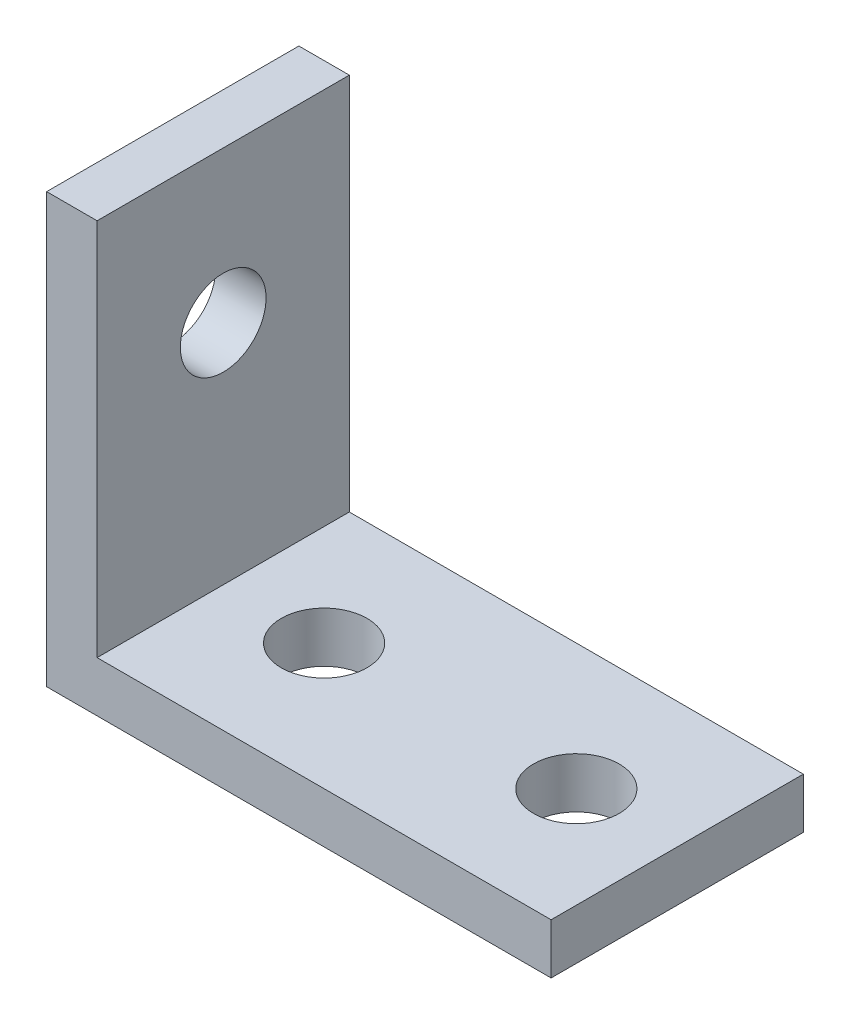
ISO-10303-21;
HEADER;
FILE_DESCRIPTION(('STEP AP214'),'2;1');
FILE_NAME('part.step','',(''),(''),'','','');
FILE_SCHEMA(('AUTOMOTIVE_DESIGN { 1 0 10303 214 1 1 1 1 }'));
ENDSEC;
DATA;
#1=APPLICATION_CONTEXT('core data for automotive mechanical design processes');
#2=APPLICATION_PROTOCOL_DEFINITION('international standard','automotive_design',2000,#1);
#3=PRODUCT_CONTEXT('',#1,'mechanical');
#4=PRODUCT('Part','Part','',(#3));
#5=PRODUCT_RELATED_PRODUCT_CATEGORY('part','',(#4));
#6=PRODUCT_DEFINITION_FORMATION('','',#4);
#7=PRODUCT_DEFINITION_CONTEXT('part definition',#1,'design');
#8=PRODUCT_DEFINITION('design','',#6,#7);
#9=PRODUCT_DEFINITION_SHAPE('','',#8);
#10=(LENGTH_UNIT() NAMED_UNIT(*) SI_UNIT(.MILLI.,.METRE.));
#11=(NAMED_UNIT(*) PLANE_ANGLE_UNIT() SI_UNIT($,.RADIAN.));
#12=(NAMED_UNIT(*) SI_UNIT($,.STERADIAN.) SOLID_ANGLE_UNIT());
#13=UNCERTAINTY_MEASURE_WITH_UNIT(LENGTH_MEASURE(1.E-05),#10,'distance_accuracy_value','');
#14=(GEOMETRIC_REPRESENTATION_CONTEXT(3) GLOBAL_UNCERTAINTY_ASSIGNED_CONTEXT((#13)) GLOBAL_UNIT_ASSIGNED_CONTEXT((#10,
#11,#12)) REPRESENTATION_CONTEXT('',''));
#15=CARTESIAN_POINT('',(0.,0.,0.));
#16=DIRECTION('',(0.,0.,1.));
#17=DIRECTION('',(1.,0.,0.));
#18=AXIS2_PLACEMENT_3D('',#15,#16,#17);
#19=CARTESIAN_POINT('',(0.,8.5,5.));
#20=DIRECTION('',(1.,0.,0.));
#21=DIRECTION('',(0.,1.,0.));
#22=AXIS2_PLACEMENT_3D('',#19,#20,#21);
#23=PLANE('',#22);
#24=CARTESIAN_POINT('',(0.,5.5,2.5));
#25=DIRECTION('',(1.,0.,0.));
#26=DIRECTION('',(0.,1.,0.));
#27=AXIS2_PLACEMENT_3D('',#24,#25,#26);
#28=CIRCLE('',#27,0.85);
#29=CARTESIAN_POINT('',(0.,6.35,2.5));
#30=VERTEX_POINT('',#29);
#31=EDGE_CURVE('E133',#30,#30,#28,.T.);
#32=ORIENTED_EDGE('',*,*,#31,.T.);
#33=EDGE_LOOP('',(#32));
#34=FACE_BOUND('',#33,.T.);
#35=DIRECTION('',(0.,-1.,0.));
#36=VECTOR('',#35,1.);
#37=CARTESIAN_POINT('',(0.,8.5,0.));
#38=LINE('',#37,#36);
#39=CARTESIAN_POINT('',(0.,8.5,0.));
#40=VERTEX_POINT('',#39);
#41=CARTESIAN_POINT('',(0.,0.,0.));
#42=VERTEX_POINT('',#41);
#43=EDGE_CURVE('E128',#40,#42,#38,.T.);
#44=ORIENTED_EDGE('',*,*,#43,.T.);
#45=DIRECTION('',(0.,0.,-1.));
#46=VECTOR('',#45,1.);
#47=CARTESIAN_POINT('',(0.,0.,5.));
#48=LINE('',#47,#46);
#49=CARTESIAN_POINT('',(0.,0.,5.));
#50=VERTEX_POINT('',#49);
#51=EDGE_CURVE('E11',#50,#42,#48,.T.);
#52=ORIENTED_EDGE('',*,*,#51,.F.);
#53=DIRECTION('',(0.,-1.,0.));
#54=VECTOR('',#53,1.);
#55=CARTESIAN_POINT('',(0.,8.5,5.));
#56=LINE('',#55,#54);
#57=CARTESIAN_POINT('',(0.,8.5,5.));
#58=VERTEX_POINT('',#57);
#59=EDGE_CURVE('E145',#58,#50,#56,.T.);
#60=ORIENTED_EDGE('',*,*,#59,.F.);
#61=DIRECTION('',(0.,0.,-1.));
#62=VECTOR('',#61,1.);
#63=CARTESIAN_POINT('',(0.,8.5,5.));
#64=LINE('',#63,#62);
#65=EDGE_CURVE('E124',#58,#40,#64,.T.);
#66=ORIENTED_EDGE('',*,*,#65,.T.);
#67=EDGE_LOOP('',(#44,#52,#60,#66));
#68=FACE_BOUND('',#67,.T.);
#69=ADVANCED_FACE('F39',(#34,#68),#23,.F.);
#70=CARTESIAN_POINT('',(0.,0.,5.));
#71=DIRECTION('',(0.,1.,0.));
#72=DIRECTION('',(0.,0.,1.));
#73=AXIS2_PLACEMENT_3D('',#70,#71,#72);
#74=PLANE('',#73);
#75=CARTESIAN_POINT('',(3.,0.,2.5));
#76=DIRECTION('',(0.,1.,0.));
#77=DIRECTION('',(0.,0.,1.));
#78=AXIS2_PLACEMENT_3D('',#75,#76,#77);
#79=CIRCLE('',#78,0.85);
#80=CARTESIAN_POINT('',(3.,0.,3.35));
#81=VERTEX_POINT('',#80);
#82=EDGE_CURVE('E188',#81,#81,#79,.T.);
#83=ORIENTED_EDGE('',*,*,#82,.T.);
#84=EDGE_LOOP('',(#83));
#85=FACE_BOUND('',#84,.T.);
#86=CARTESIAN_POINT('',(8.,0.,2.5));
#87=DIRECTION('',(0.,1.,0.));
#88=DIRECTION('',(0.,0.,1.));
#89=AXIS2_PLACEMENT_3D('',#86,#87,#88);
#90=CIRCLE('',#89,0.85);
#91=CARTESIAN_POINT('',(8.,0.,3.35));
#92=VERTEX_POINT('',#91);
#93=EDGE_CURVE('E199',#92,#92,#90,.T.);
#94=ORIENTED_EDGE('',*,*,#93,.T.);
#95=EDGE_LOOP('',(#94));
#96=FACE_BOUND('',#95,.T.);
#97=DIRECTION('',(1.,0.,0.));
#98=VECTOR('',#97,1.);
#99=CARTESIAN_POINT('',(0.,0.,0.));
#100=LINE('',#99,#98);
#101=CARTESIAN_POINT('',(10.,0.,0.));
#102=VERTEX_POINT('',#101);
#103=EDGE_CURVE('E132',#42,#102,#100,.T.);
#104=ORIENTED_EDGE('',*,*,#103,.T.);
#105=DIRECTION('',(0.,0.,-1.));
#106=VECTOR('',#105,1.);
#107=CARTESIAN_POINT('',(10.,0.,5.));
#108=LINE('',#107,#106);
#109=CARTESIAN_POINT('',(10.,0.,5.));
#110=VERTEX_POINT('',#109);
#111=EDGE_CURVE('E48',#110,#102,#108,.T.);
#112=ORIENTED_EDGE('',*,*,#111,.F.);
#113=DIRECTION('',(1.,0.,0.));
#114=VECTOR('',#113,1.);
#115=CARTESIAN_POINT('',(0.,0.,5.));
#116=LINE('',#115,#114);
#117=EDGE_CURVE('E93',#50,#110,#116,.T.);
#118=ORIENTED_EDGE('',*,*,#117,.F.);
#119=ORIENTED_EDGE('',*,*,#51,.T.);
#120=EDGE_LOOP('',(#104,#112,#118,#119));
#121=FACE_BOUND('',#120,.T.);
#122=ADVANCED_FACE('F174',(#85,#96,#121),#74,.F.);
#123=CARTESIAN_POINT('',(10.,0.,5.));
#124=DIRECTION('',(-1.,0.,0.));
#125=DIRECTION('',(0.,0.,1.));
#126=AXIS2_PLACEMENT_3D('',#123,#124,#125);
#127=PLANE('',#126);
#128=DIRECTION('',(0.,1.,0.));
#129=VECTOR('',#128,1.);
#130=CARTESIAN_POINT('',(10.,0.,0.));
#131=LINE('',#130,#129);
#132=CARTESIAN_POINT('',(10.,1.,0.));
#133=VERTEX_POINT('',#132);
#134=EDGE_CURVE('E136',#102,#133,#131,.T.);
#135=ORIENTED_EDGE('',*,*,#134,.T.);
#136=DIRECTION('',(0.,0.,-1.));
#137=VECTOR('',#136,1.);
#138=CARTESIAN_POINT('',(10.,1.,5.));
#139=LINE('',#138,#137);
#140=CARTESIAN_POINT('',(10.,1.,5.));
#141=VERTEX_POINT('',#140);
#142=EDGE_CURVE('E117',#141,#133,#139,.T.);
#143=ORIENTED_EDGE('',*,*,#142,.F.);
#144=DIRECTION('',(0.,1.,0.));
#145=VECTOR('',#144,1.);
#146=CARTESIAN_POINT('',(10.,0.,5.));
#147=LINE('',#146,#145);
#148=EDGE_CURVE('E106',#110,#141,#147,.T.);
#149=ORIENTED_EDGE('',*,*,#148,.F.);
#150=ORIENTED_EDGE('',*,*,#111,.T.);
#151=EDGE_LOOP('',(#135,#143,#149,#150));
#152=FACE_BOUND('',#151,.T.);
#153=ADVANCED_FACE('F155',(#152),#127,.F.);
#154=CARTESIAN_POINT('',(10.,1.,5.));
#155=DIRECTION('',(0.,-1.,0.));
#156=DIRECTION('',(1.,0.,0.));
#157=AXIS2_PLACEMENT_3D('',#154,#155,#156);
#158=PLANE('',#157);
#159=CARTESIAN_POINT('',(3.,0.999999999999999,2.5));
#160=DIRECTION('',(0.,1.,0.));
#161=DIRECTION('',(-1.,0.,0.));
#162=AXIS2_PLACEMENT_3D('',#159,#160,#161);
#163=CIRCLE('',#162,0.85);
#164=CARTESIAN_POINT('',(2.15,0.999999999999999,2.5));
#165=VERTEX_POINT('',#164);
#166=EDGE_CURVE('E203',#165,#165,#163,.T.);
#167=ORIENTED_EDGE('',*,*,#166,.F.);
#168=EDGE_LOOP('',(#167));
#169=FACE_BOUND('',#168,.T.);
#170=CARTESIAN_POINT('',(8.,1.,2.5));
#171=DIRECTION('',(0.,1.,0.));
#172=DIRECTION('',(-1.,0.,0.));
#173=AXIS2_PLACEMENT_3D('',#170,#171,#172);
#174=CIRCLE('',#173,0.85);
#175=CARTESIAN_POINT('',(7.15,1.,2.5));
#176=VERTEX_POINT('',#175);
#177=EDGE_CURVE('E204',#176,#176,#174,.T.);
#178=ORIENTED_EDGE('',*,*,#177,.F.);
#179=EDGE_LOOP('',(#178));
#180=FACE_BOUND('',#179,.T.);
#181=DIRECTION('',(-1.,0.,0.));
#182=VECTOR('',#181,1.);
#183=CARTESIAN_POINT('',(10.,1.,0.));
#184=LINE('',#183,#182);
#185=CARTESIAN_POINT('',(0.999999999999999,0.999999999999999,0.));
#186=VERTEX_POINT('',#185);
#187=EDGE_CURVE('E115',#133,#186,#184,.T.);
#188=ORIENTED_EDGE('',*,*,#187,.T.);
#189=DIRECTION('',(0.,0.,-1.));
#190=VECTOR('',#189,1.);
#191=CARTESIAN_POINT('',(0.999999999999999,0.999999999999999,5.));
#192=LINE('',#191,#190);
#193=CARTESIAN_POINT('',(0.999999999999999,0.999999999999999,5.));
#194=VERTEX_POINT('',#193);
#195=EDGE_CURVE('E112',#194,#186,#192,.T.);
#196=ORIENTED_EDGE('',*,*,#195,.F.);
#197=DIRECTION('',(-1.,0.,0.));
#198=VECTOR('',#197,1.);
#199=CARTESIAN_POINT('',(10.,1.,5.));
#200=LINE('',#199,#198);
#201=EDGE_CURVE('E100',#141,#194,#200,.T.);
#202=ORIENTED_EDGE('',*,*,#201,.F.);
#203=ORIENTED_EDGE('',*,*,#142,.T.);
#204=EDGE_LOOP('',(#188,#196,#202,#203));
#205=FACE_BOUND('',#204,.T.);
#206=ADVANCED_FACE('F113',(#169,#180,#205),#158,.F.);
#207=CARTESIAN_POINT('',(0.999999999999999,0.999999999999999,5.));
#208=DIRECTION('',(-1.,0.,0.));
#209=DIRECTION('',(0.,-1.,0.));
#210=AXIS2_PLACEMENT_3D('',#207,#208,#209);
#211=PLANE('',#210);
#212=CARTESIAN_POINT('',(1.,5.5,2.5));
#213=DIRECTION('',(1.,0.,0.));
#214=DIRECTION('',(0.,1.,0.));
#215=AXIS2_PLACEMENT_3D('',#212,#213,#214);
#216=CIRCLE('',#215,0.85);
#217=CARTESIAN_POINT('',(1.,6.35,2.5));
#218=VERTEX_POINT('',#217);
#219=EDGE_CURVE('E184',#218,#218,#216,.T.);
#220=ORIENTED_EDGE('',*,*,#219,.F.);
#221=EDGE_LOOP('',(#220));
#222=FACE_BOUND('',#221,.T.);
#223=DIRECTION('',(0.,1.,0.));
#224=VECTOR('',#223,1.);
#225=CARTESIAN_POINT('',(0.999999999999999,0.999999999999999,0.));
#226=LINE('',#225,#224);
#227=CARTESIAN_POINT('',(1.,8.5,0.));
#228=VERTEX_POINT('',#227);
#229=EDGE_CURVE('E79',#186,#228,#226,.T.);
#230=ORIENTED_EDGE('',*,*,#229,.T.);
#231=DIRECTION('',(0.,0.,-1.));
#232=VECTOR('',#231,1.);
#233=CARTESIAN_POINT('',(1.,8.5,5.));
#234=LINE('',#233,#232);
#235=CARTESIAN_POINT('',(1.,8.5,5.));
#236=VERTEX_POINT('',#235);
#237=EDGE_CURVE('E118',#236,#228,#234,.T.);
#238=ORIENTED_EDGE('',*,*,#237,.F.);
#239=DIRECTION('',(0.,1.,0.));
#240=VECTOR('',#239,1.);
#241=CARTESIAN_POINT('',(0.999999999999999,0.999999999999999,5.));
#242=LINE('',#241,#240);
#243=EDGE_CURVE('E104',#194,#236,#242,.T.);
#244=ORIENTED_EDGE('',*,*,#243,.F.);
#245=ORIENTED_EDGE('',*,*,#195,.T.);
#246=EDGE_LOOP('',(#230,#238,#244,#245));
#247=FACE_BOUND('',#246,.T.);
#248=ADVANCED_FACE('F120',(#222,#247),#211,.F.);
#249=CARTESIAN_POINT('',(1.,8.5,5.));
#250=DIRECTION('',(0.,-1.,0.));
#251=DIRECTION('',(0.,0.,-1.));
#252=AXIS2_PLACEMENT_3D('',#249,#250,#251);
#253=PLANE('',#252);
#254=DIRECTION('',(-1.,0.,0.));
#255=VECTOR('',#254,1.);
#256=CARTESIAN_POINT('',(1.,8.5,0.));
#257=LINE('',#256,#255);
#258=EDGE_CURVE('E85',#228,#40,#257,.T.);
#259=ORIENTED_EDGE('',*,*,#258,.T.);
#260=ORIENTED_EDGE('',*,*,#65,.F.);
#261=DIRECTION('',(-1.,0.,0.));
#262=VECTOR('',#261,1.);
#263=CARTESIAN_POINT('',(1.,8.5,5.));
#264=LINE('',#263,#262);
#265=EDGE_CURVE('E56',#236,#58,#264,.T.);
#266=ORIENTED_EDGE('',*,*,#265,.F.);
#267=ORIENTED_EDGE('',*,*,#237,.T.);
#268=EDGE_LOOP('',(#259,#260,#266,#267));
#269=FACE_BOUND('',#268,.T.);
#270=ADVANCED_FACE('F162',(#269),#253,.F.);
#271=CARTESIAN_POINT('',(0.,0.,5.));
#272=DIRECTION('',(0.,0.,1.));
#273=DIRECTION('',(1.,0.,0.));
#274=AXIS2_PLACEMENT_3D('',#271,#272,#273);
#275=PLANE('',#274);
#276=ORIENTED_EDGE('',*,*,#59,.T.);
#277=ORIENTED_EDGE('',*,*,#117,.T.);
#278=ORIENTED_EDGE('',*,*,#148,.T.);
#279=ORIENTED_EDGE('',*,*,#201,.T.);
#280=ORIENTED_EDGE('',*,*,#243,.T.);
#281=ORIENTED_EDGE('',*,*,#265,.T.);
#282=EDGE_LOOP('',(#276,#277,#278,#279,#280,#281));
#283=FACE_BOUND('',#282,.T.);
#284=ADVANCED_FACE('F102',(#283),#275,.T.);
#285=CARTESIAN_POINT('',(0.,0.,0.));
#286=DIRECTION('',(0.,0.,1.));
#287=DIRECTION('',(1.,0.,0.));
#288=AXIS2_PLACEMENT_3D('',#285,#286,#287);
#289=PLANE('',#288);
#290=ORIENTED_EDGE('',*,*,#43,.F.);
#291=ORIENTED_EDGE('',*,*,#258,.F.);
#292=ORIENTED_EDGE('',*,*,#229,.F.);
#293=ORIENTED_EDGE('',*,*,#187,.F.);
#294=ORIENTED_EDGE('',*,*,#134,.F.);
#295=ORIENTED_EDGE('',*,*,#103,.F.);
#296=EDGE_LOOP('',(#290,#291,#292,#293,#294,#295));
#297=FACE_BOUND('',#296,.T.);
#298=ADVANCED_FACE('F158',(#297),#289,.F.);
#299=CARTESIAN_POINT('',(-5.,5.5,2.5));
#300=DIRECTION('',(1.,0.,0.));
#301=DIRECTION('',(0.,1.,0.));
#302=AXIS2_PLACEMENT_3D('',#299,#300,#301);
#303=CYLINDRICAL_SURFACE('',#302,0.85);
#304=ORIENTED_EDGE('',*,*,#219,.T.);
#305=EDGE_LOOP('',(#304));
#306=FACE_BOUND('',#305,.T.);
#307=ORIENTED_EDGE('',*,*,#31,.F.);
#308=EDGE_LOOP('',(#307));
#309=FACE_BOUND('',#308,.T.);
#310=ADVANCED_FACE('F223',(#306,#309),#303,.F.);
#311=CARTESIAN_POINT('',(8.,-5.,2.5));
#312=DIRECTION('',(0.,1.,0.));
#313=DIRECTION('',(-1.,0.,0.));
#314=AXIS2_PLACEMENT_3D('',#311,#312,#313);
#315=CYLINDRICAL_SURFACE('',#314,0.85);
#316=ORIENTED_EDGE('',*,*,#177,.T.);
#317=EDGE_LOOP('',(#316));
#318=FACE_BOUND('',#317,.T.);
#319=ORIENTED_EDGE('',*,*,#93,.F.);
#320=EDGE_LOOP('',(#319));
#321=FACE_BOUND('',#320,.T.);
#322=ADVANCED_FACE('F220',(#318,#321),#315,.F.);
#323=CARTESIAN_POINT('',(3.,-5.,2.5));
#324=DIRECTION('',(0.,1.,0.));
#325=DIRECTION('',(-1.,0.,0.));
#326=AXIS2_PLACEMENT_3D('',#323,#324,#325);
#327=CYLINDRICAL_SURFACE('',#326,0.85);
#328=ORIENTED_EDGE('',*,*,#166,.T.);
#329=EDGE_LOOP('',(#328));
#330=FACE_BOUND('',#329,.T.);
#331=ORIENTED_EDGE('',*,*,#82,.F.);
#332=EDGE_LOOP('',(#331));
#333=FACE_BOUND('',#332,.T.);
#334=ADVANCED_FACE('F212',(#330,#333),#327,.F.);
#335=CLOSED_SHELL('',(#69,#122,#153,#206,#248,#270,#284,#298,#310,#322,#334));
#336=MANIFOLD_SOLID_BREP('B2',#335);
#337=ADVANCED_BREP_SHAPE_REPRESENTATION('',(#18,#336),#14);
#338=SHAPE_DEFINITION_REPRESENTATION(#9,#337);
ENDSEC;
END-ISO-10303-21;
